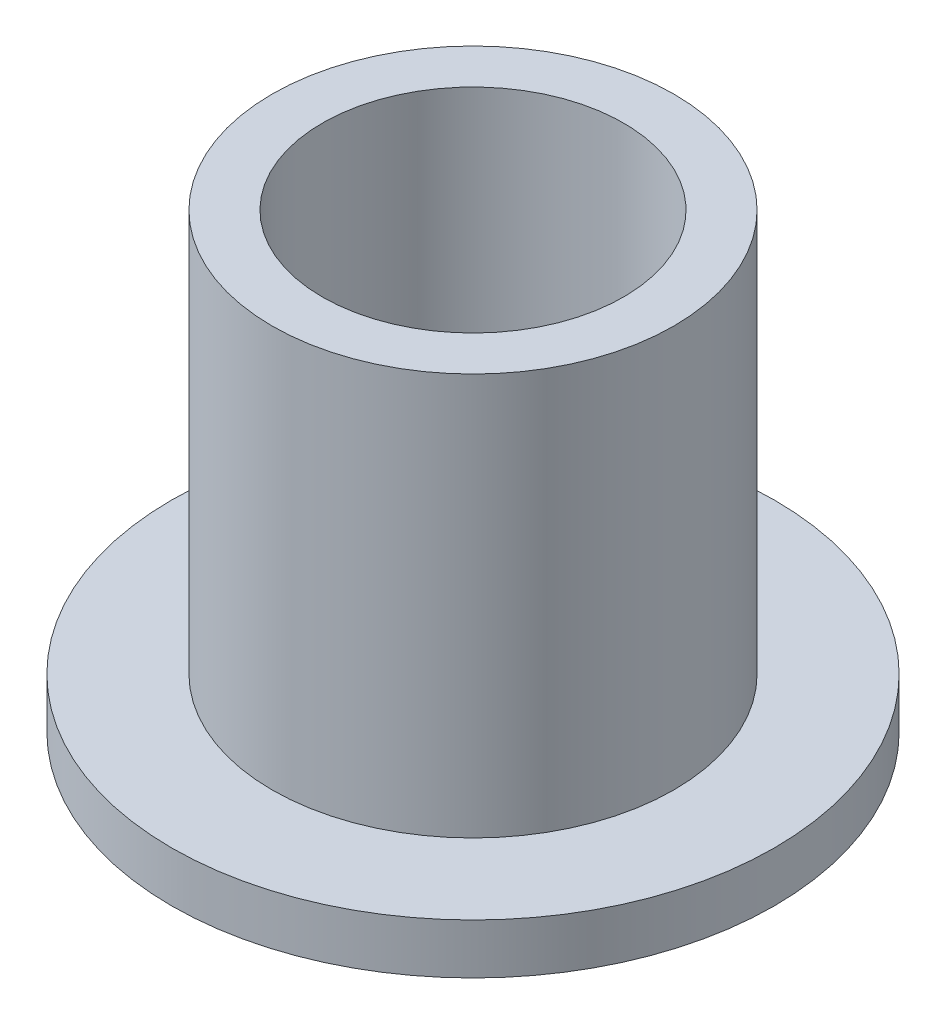
ISO-10303-21;
HEADER;
FILE_DESCRIPTION(('STEP AP214'),'2;1');
FILE_NAME('part.step','',(''),(''),'','','');
FILE_SCHEMA(('AUTOMOTIVE_DESIGN { 1 0 10303 214 1 1 1 1 }'));
ENDSEC;
DATA;
#1=APPLICATION_CONTEXT('core data for automotive mechanical design processes');
#2=APPLICATION_PROTOCOL_DEFINITION('international standard','automotive_design',2000,#1);
#3=PRODUCT_CONTEXT('',#1,'mechanical');
#4=PRODUCT('Part','Part','',(#3));
#5=PRODUCT_RELATED_PRODUCT_CATEGORY('part','',(#4));
#6=PRODUCT_DEFINITION_FORMATION('','',#4);
#7=PRODUCT_DEFINITION_CONTEXT('part definition',#1,'design');
#8=PRODUCT_DEFINITION('design','',#6,#7);
#9=PRODUCT_DEFINITION_SHAPE('','',#8);
#10=(LENGTH_UNIT() NAMED_UNIT(*) SI_UNIT(.MILLI.,.METRE.));
#11=(NAMED_UNIT(*) PLANE_ANGLE_UNIT() SI_UNIT($,.RADIAN.));
#12=(NAMED_UNIT(*) SI_UNIT($,.STERADIAN.) SOLID_ANGLE_UNIT());
#13=UNCERTAINTY_MEASURE_WITH_UNIT(LENGTH_MEASURE(1.E-05),#10,'distance_accuracy_value','');
#14=(GEOMETRIC_REPRESENTATION_CONTEXT(3) GLOBAL_UNCERTAINTY_ASSIGNED_CONTEXT((#13)) GLOBAL_UNIT_ASSIGNED_CONTEXT((#10,
#11,#12)) REPRESENTATION_CONTEXT('',''));
#15=CARTESIAN_POINT('',(0.,0.,0.));
#16=DIRECTION('',(0.,0.,1.));
#17=DIRECTION('',(1.,0.,0.));
#18=AXIS2_PLACEMENT_3D('',#15,#16,#17);
#19=CARTESIAN_POINT('',(0.,1.,0.));
#20=DIRECTION('',(0.,1.,0.));
#21=DIRECTION('',(0.,0.,1.));
#22=AXIS2_PLACEMENT_3D('',#19,#20,#21);
#23=PLANE('',#22);
#24=CARTESIAN_POINT('',(0.,1.,0.));
#25=DIRECTION('',(0.,1.,0.));
#26=DIRECTION('',(0.,0.,1.));
#27=AXIS2_PLACEMENT_3D('',#24,#25,#26);
#28=CIRCLE('',#27,6.);
#29=CARTESIAN_POINT('',(0.,1.,6.));
#30=VERTEX_POINT('',#29);
#31=EDGE_CURVE('E10',#30,#30,#28,.T.);
#32=ORIENTED_EDGE('',*,*,#31,.T.);
#33=EDGE_LOOP('',(#32));
#34=FACE_BOUND('',#33,.T.);
#35=CARTESIAN_POINT('',(0.,1.,0.));
#36=DIRECTION('',(0.,1.,0.));
#37=DIRECTION('',(0.,0.,1.));
#38=AXIS2_PLACEMENT_3D('',#35,#36,#37);
#39=CIRCLE('',#38,4.);
#40=CARTESIAN_POINT('',(0.,1.,4.));
#41=VERTEX_POINT('',#40);
#42=EDGE_CURVE('E47',#41,#41,#39,.T.);
#43=ORIENTED_EDGE('',*,*,#42,.F.);
#44=EDGE_LOOP('',(#43));
#45=FACE_BOUND('',#44,.T.);
#46=ADVANCED_FACE('F31',(#34,#45),#23,.T.);
#47=CARTESIAN_POINT('',(0.,0.,0.));
#48=DIRECTION('',(0.,1.,0.));
#49=DIRECTION('',(0.,0.,1.));
#50=AXIS2_PLACEMENT_3D('',#47,#48,#49);
#51=PLANE('',#50);
#52=CARTESIAN_POINT('',(0.,0.,0.));
#53=DIRECTION('',(0.,1.,0.));
#54=DIRECTION('',(0.,0.,1.));
#55=AXIS2_PLACEMENT_3D('',#52,#53,#54);
#56=CIRCLE('',#55,6.);
#57=CARTESIAN_POINT('',(0.,0.,6.));
#58=VERTEX_POINT('',#57);
#59=EDGE_CURVE('E35',#58,#58,#56,.T.);
#60=ORIENTED_EDGE('',*,*,#59,.F.);
#61=EDGE_LOOP('',(#60));
#62=FACE_BOUND('',#61,.T.);
#63=CARTESIAN_POINT('',(0.,0.,0.));
#64=DIRECTION('',(0.,1.,0.));
#65=DIRECTION('',(0.,0.,1.));
#66=AXIS2_PLACEMENT_3D('',#63,#64,#65);
#67=CIRCLE('',#66,3.);
#68=CARTESIAN_POINT('',(0.,0.,3.));
#69=VERTEX_POINT('',#68);
#70=EDGE_CURVE('E42',#69,#69,#67,.T.);
#71=ORIENTED_EDGE('',*,*,#70,.T.);
#72=EDGE_LOOP('',(#71));
#73=FACE_BOUND('',#72,.T.);
#74=ADVANCED_FACE('F72',(#62,#73),#51,.F.);
#75=CARTESIAN_POINT('',(0.,1.,0.));
#76=DIRECTION('',(0.,-1.,0.));
#77=DIRECTION('',(0.,0.,-1.));
#78=AXIS2_PLACEMENT_3D('',#75,#76,#77);
#79=CYLINDRICAL_SURFACE('',#78,6.);
#80=ORIENTED_EDGE('',*,*,#31,.F.);
#81=EDGE_LOOP('',(#80));
#82=FACE_BOUND('',#81,.T.);
#83=ORIENTED_EDGE('',*,*,#59,.T.);
#84=EDGE_LOOP('',(#83));
#85=FACE_BOUND('',#84,.T.);
#86=ADVANCED_FACE('F33',(#82,#85),#79,.T.);
#87=CARTESIAN_POINT('',(0.,1.,0.));
#88=DIRECTION('',(0.,-1.,0.));
#89=DIRECTION('',(0.,0.,-1.));
#90=AXIS2_PLACEMENT_3D('',#87,#88,#89);
#91=CYLINDRICAL_SURFACE('',#90,3.);
#92=ORIENTED_EDGE('',*,*,#70,.F.);
#93=EDGE_LOOP('',(#92));
#94=FACE_BOUND('',#93,.T.);
#95=CARTESIAN_POINT('',(0.,9.,0.));
#96=DIRECTION('',(0.,1.,0.));
#97=DIRECTION('',(0.,0.,1.));
#98=AXIS2_PLACEMENT_3D('',#95,#96,#97);
#99=CIRCLE('',#98,3.);
#100=CARTESIAN_POINT('',(0.,9.,3.));
#101=VERTEX_POINT('',#100);
#102=EDGE_CURVE('E50',#101,#101,#99,.T.);
#103=ORIENTED_EDGE('',*,*,#102,.T.);
#104=EDGE_LOOP('',(#103));
#105=FACE_BOUND('',#104,.T.);
#106=ADVANCED_FACE('F56',(#94,#105),#91,.F.);
#107=CARTESIAN_POINT('',(0.,9.,0.));
#108=DIRECTION('',(0.,1.,0.));
#109=DIRECTION('',(0.,0.,1.));
#110=AXIS2_PLACEMENT_3D('',#107,#108,#109);
#111=PLANE('',#110);
#112=CARTESIAN_POINT('',(0.,9.,0.));
#113=DIRECTION('',(0.,1.,0.));
#114=DIRECTION('',(0.,0.,1.));
#115=AXIS2_PLACEMENT_3D('',#112,#113,#114);
#116=CIRCLE('',#115,4.);
#117=CARTESIAN_POINT('',(0.,9.,4.));
#118=VERTEX_POINT('',#117);
#119=EDGE_CURVE('E46',#118,#118,#116,.T.);
#120=ORIENTED_EDGE('',*,*,#119,.T.);
#121=EDGE_LOOP('',(#120));
#122=FACE_BOUND('',#121,.T.);
#123=ORIENTED_EDGE('',*,*,#102,.F.);
#124=EDGE_LOOP('',(#123));
#125=FACE_BOUND('',#124,.T.);
#126=ADVANCED_FACE('F58',(#122,#125),#111,.T.);
#127=CARTESIAN_POINT('',(0.,9.,0.));
#128=DIRECTION('',(0.,-1.,0.));
#129=DIRECTION('',(0.,0.,-1.));
#130=AXIS2_PLACEMENT_3D('',#127,#128,#129);
#131=CYLINDRICAL_SURFACE('',#130,4.);
#132=ORIENTED_EDGE('',*,*,#119,.F.);
#133=EDGE_LOOP('',(#132));
#134=FACE_BOUND('',#133,.T.);
#135=ORIENTED_EDGE('',*,*,#42,.T.);
#136=EDGE_LOOP('',(#135));
#137=FACE_BOUND('',#136,.T.);
#138=ADVANCED_FACE('F60',(#134,#137),#131,.T.);
#139=CLOSED_SHELL('',(#46,#74,#86,#106,#126,#138));
#140=MANIFOLD_SOLID_BREP('B2',#139);
#141=ADVANCED_BREP_SHAPE_REPRESENTATION('',(#18,#140),#14);
#142=SHAPE_DEFINITION_REPRESENTATION(#9,#141);
ENDSEC;
END-ISO-10303-21;
